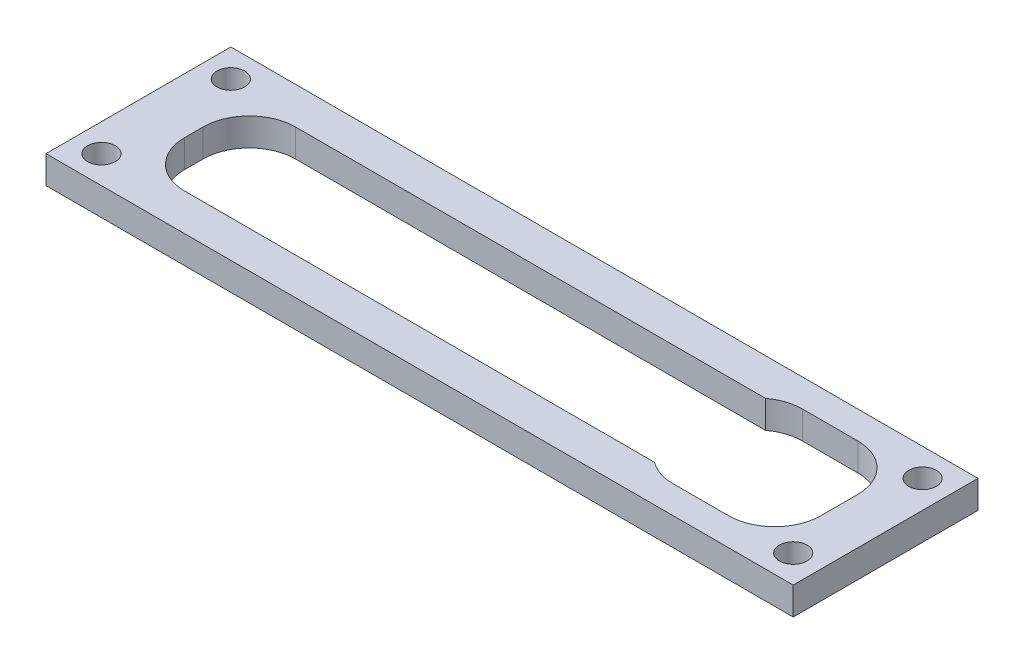
ISO-10303-21;
HEADER;
FILE_DESCRIPTION(('STEP AP214'),'2;1');
FILE_NAME('part.step','',(''),(''),'','','');
FILE_SCHEMA(('AUTOMOTIVE_DESIGN { 1 0 10303 214 1 1 1 1 }'));
ENDSEC;
DATA;
#1=APPLICATION_CONTEXT('core data for automotive mechanical design processes');
#2=APPLICATION_PROTOCOL_DEFINITION('international standard','automotive_design',2000,#1);
#3=PRODUCT_CONTEXT('',#1,'mechanical');
#4=PRODUCT('Part','Part','',(#3));
#5=PRODUCT_RELATED_PRODUCT_CATEGORY('part','',(#4));
#6=PRODUCT_DEFINITION_FORMATION('','',#4);
#7=PRODUCT_DEFINITION_CONTEXT('part definition',#1,'design');
#8=PRODUCT_DEFINITION('design','',#6,#7);
#9=PRODUCT_DEFINITION_SHAPE('','',#8);
#10=(LENGTH_UNIT() NAMED_UNIT(*) SI_UNIT(.MILLI.,.METRE.));
#11=(NAMED_UNIT(*) PLANE_ANGLE_UNIT() SI_UNIT($,.RADIAN.));
#12=(NAMED_UNIT(*) SI_UNIT($,.STERADIAN.) SOLID_ANGLE_UNIT());
#13=UNCERTAINTY_MEASURE_WITH_UNIT(LENGTH_MEASURE(1.E-05),#10,'distance_accuracy_value','');
#14=(GEOMETRIC_REPRESENTATION_CONTEXT(3) GLOBAL_UNCERTAINTY_ASSIGNED_CONTEXT((#13)) GLOBAL_UNIT_ASSIGNED_CONTEXT((#10,
#11,#12)) REPRESENTATION_CONTEXT('',''));
#15=CARTESIAN_POINT('',(0.,0.,0.));
#16=DIRECTION('',(0.,0.,1.));
#17=DIRECTION('',(1.,0.,0.));
#18=AXIS2_PLACEMENT_3D('',#15,#16,#17);
#19=CARTESIAN_POINT('',(0.,3.,0.));
#20=DIRECTION('',(0.,-1.,0.));
#21=DIRECTION('',(0.,0.,-1.));
#22=AXIS2_PLACEMENT_3D('',#19,#20,#21);
#23=PLANE('',#22);
#24=DIRECTION('',(0.,0.,1.));
#25=VECTOR('',#24,1.);
#26=CARTESIAN_POINT('',(0.,3.,0.));
#27=LINE('',#26,#25);
#28=CARTESIAN_POINT('',(0.,3.,-20.));
#29=VERTEX_POINT('',#28);
#30=CARTESIAN_POINT('',(0.,3.,0.));
#31=VERTEX_POINT('',#30);
#32=EDGE_CURVE('E250',#29,#31,#27,.T.);
#33=ORIENTED_EDGE('',*,*,#32,.T.);
#34=DIRECTION('',(1.,0.,0.));
#35=VECTOR('',#34,1.);
#36=CARTESIAN_POINT('',(0.,3.,0.));
#37=LINE('',#36,#35);
#38=CARTESIAN_POINT('',(80.8638902656017,3.,0.));
#39=VERTEX_POINT('',#38);
#40=EDGE_CURVE('E253',#31,#39,#37,.T.);
#41=ORIENTED_EDGE('',*,*,#40,.T.);
#42=DIRECTION('',(0.,0.,-1.));
#43=VECTOR('',#42,1.);
#44=CARTESIAN_POINT('',(80.8638902656017,3.,0.));
#45=LINE('',#44,#43);
#46=CARTESIAN_POINT('',(80.8638902656017,3.,-20.));
#47=VERTEX_POINT('',#46);
#48=EDGE_CURVE('E256',#39,#47,#45,.T.);
#49=ORIENTED_EDGE('',*,*,#48,.T.);
#50=DIRECTION('',(-1.,0.,0.));
#51=VECTOR('',#50,1.);
#52=CARTESIAN_POINT('',(0.,3.,-20.));
#53=LINE('',#52,#51);
#54=EDGE_CURVE('E258',#47,#29,#53,.T.);
#55=ORIENTED_EDGE('',*,*,#54,.T.);
#56=EDGE_LOOP('',(#33,#41,#49,#55));
#57=FACE_BOUND('',#56,.T.);
#58=DIRECTION('',(-1.,0.,0.));
#59=VECTOR('',#58,1.);
#60=CARTESIAN_POINT('',(5.99999999999999,3.,-16.));
#61=LINE('',#60,#59);
#62=CARTESIAN_POINT('',(61.8638902656017,3.,-16.));
#63=VERTEX_POINT('',#62);
#64=CARTESIAN_POINT('',(11.,3.,-16.));
#65=VERTEX_POINT('',#64);
#66=EDGE_CURVE('E243',#63,#65,#61,.T.);
#67=ORIENTED_EDGE('',*,*,#66,.F.);
#68=CARTESIAN_POINT('',(64.8638902656017,3.,-12.));
#69=DIRECTION('',(0.,-1.,0.));
#70=DIRECTION('',(0.,0.,-1.));
#71=AXIS2_PLACEMENT_3D('',#68,#69,#70);
#72=CIRCLE('',#71,5.);
#73=CARTESIAN_POINT('',(64.8638902656017,3.,-17.));
#74=VERTEX_POINT('',#73);
#75=EDGE_CURVE('E193',#63,#74,#72,.T.);
#76=ORIENTED_EDGE('',*,*,#75,.T.);
#77=DIRECTION('',(-1.,0.,0.));
#78=VECTOR('',#77,1.);
#79=CARTESIAN_POINT('',(61.8638902656017,3.,-17.));
#80=LINE('',#79,#78);
#81=CARTESIAN_POINT('',(70.8638902656017,3.,-17.));
#82=VERTEX_POINT('',#81);
#83=EDGE_CURVE('E205',#82,#74,#80,.T.);
#84=ORIENTED_EDGE('',*,*,#83,.F.);
#85=CARTESIAN_POINT('',(70.8638902656017,3.,-12.));
#86=DIRECTION('',(0.,-1.,0.));
#87=DIRECTION('',(0.,0.,-1.));
#88=AXIS2_PLACEMENT_3D('',#85,#86,#87);
#89=CIRCLE('',#88,5.);
#90=CARTESIAN_POINT('',(75.8638902656017,3.,-12.));
#91=VERTEX_POINT('',#90);
#92=EDGE_CURVE('E185',#82,#91,#89,.T.);
#93=ORIENTED_EDGE('',*,*,#92,.T.);
#94=DIRECTION('',(0.,0.,-1.));
#95=VECTOR('',#94,1.);
#96=CARTESIAN_POINT('',(75.8638902656017,3.,-17.));
#97=LINE('',#96,#95);
#98=CARTESIAN_POINT('',(75.8638902656017,3.,-8.00000000000001));
#99=VERTEX_POINT('',#98);
#100=EDGE_CURVE('E202',#99,#91,#97,.T.);
#101=ORIENTED_EDGE('',*,*,#100,.F.);
#102=CARTESIAN_POINT('',(70.8638902656017,3.,-8.00000000000001));
#103=DIRECTION('',(0.,-1.,0.));
#104=DIRECTION('',(0.,0.,-1.));
#105=AXIS2_PLACEMENT_3D('',#102,#103,#104);
#106=CIRCLE('',#105,5.);
#107=CARTESIAN_POINT('',(70.8638902656017,3.,-3.00000000000001));
#108=VERTEX_POINT('',#107);
#109=EDGE_CURVE('E189',#99,#108,#106,.T.);
#110=ORIENTED_EDGE('',*,*,#109,.T.);
#111=DIRECTION('',(1.,0.,0.));
#112=VECTOR('',#111,1.);
#113=CARTESIAN_POINT('',(61.8638902656017,3.,-3.00000000000001));
#114=LINE('',#113,#112);
#115=CARTESIAN_POINT('',(64.8638902656017,3.,-3.00000000000001));
#116=VERTEX_POINT('',#115);
#117=EDGE_CURVE('E200',#116,#108,#114,.T.);
#118=ORIENTED_EDGE('',*,*,#117,.F.);
#119=CARTESIAN_POINT('',(64.8638902656017,3.,-8.00000000000001));
#120=DIRECTION('',(0.,-1.,0.));
#121=DIRECTION('',(0.,0.,-1.));
#122=AXIS2_PLACEMENT_3D('',#119,#120,#121);
#123=CIRCLE('',#122,5.);
#124=CARTESIAN_POINT('',(61.8638902656017,3.,-4.00000000000001));
#125=VERTEX_POINT('',#124);
#126=EDGE_CURVE('E43',#116,#125,#123,.T.);
#127=ORIENTED_EDGE('',*,*,#126,.T.);
#128=DIRECTION('',(1.,0.,0.));
#129=VECTOR('',#128,1.);
#130=CARTESIAN_POINT('',(5.99999999999999,3.,-4.00000000000002));
#131=LINE('',#130,#129);
#132=CARTESIAN_POINT('',(11.,3.,-4.00000000000002));
#133=VERTEX_POINT('',#132);
#134=EDGE_CURVE('E162',#133,#125,#131,.T.);
#135=ORIENTED_EDGE('',*,*,#134,.F.);
#136=CARTESIAN_POINT('',(11.,3.,-9.00000000000001));
#137=DIRECTION('',(0.,-1.,0.));
#138=DIRECTION('',(0.,0.,-1.));
#139=AXIS2_PLACEMENT_3D('',#136,#137,#138);
#140=CIRCLE('',#139,5.);
#141=CARTESIAN_POINT('',(5.99999999999999,3.,-9.00000000000001));
#142=VERTEX_POINT('',#141);
#143=EDGE_CURVE('E179',#133,#142,#140,.T.);
#144=ORIENTED_EDGE('',*,*,#143,.T.);
#145=DIRECTION('',(0.,0.,1.));
#146=VECTOR('',#145,1.);
#147=CARTESIAN_POINT('',(5.99999999999999,3.,-16.));
#148=LINE('',#147,#146);
#149=CARTESIAN_POINT('',(5.99999999999999,3.,-11.));
#150=VERTEX_POINT('',#149);
#151=EDGE_CURVE('E239',#150,#142,#148,.T.);
#152=ORIENTED_EDGE('',*,*,#151,.F.);
#153=CARTESIAN_POINT('',(11.,3.,-11.));
#154=DIRECTION('',(0.,-1.,0.));
#155=DIRECTION('',(0.,0.,-1.));
#156=AXIS2_PLACEMENT_3D('',#153,#154,#155);
#157=CIRCLE('',#156,5.);
#158=EDGE_CURVE('E183',#150,#65,#157,.T.);
#159=ORIENTED_EDGE('',*,*,#158,.T.);
#160=EDGE_LOOP('',(#67,#76,#84,#93,#101,#110,#118,#127,#135,#144,#152,#159));
#161=FACE_BOUND('',#160,.T.);
#162=CARTESIAN_POINT('',(3.,3.,-17.));
#163=DIRECTION('',(0.,1.,0.));
#164=DIRECTION('',(0.,0.,1.));
#165=AXIS2_PLACEMENT_3D('',#162,#163,#164);
#166=CIRCLE('',#165,1.5);
#167=CARTESIAN_POINT('',(3.,3.,-15.5));
#168=VERTEX_POINT('',#167);
#169=EDGE_CURVE('E234',#168,#168,#166,.T.);
#170=ORIENTED_EDGE('',*,*,#169,.F.);
#171=EDGE_LOOP('',(#170));
#172=FACE_BOUND('',#171,.T.);
#173=CARTESIAN_POINT('',(3.,3.,-3.));
#174=DIRECTION('',(0.,1.,0.));
#175=DIRECTION('',(0.,0.,-1.));
#176=AXIS2_PLACEMENT_3D('',#173,#174,#175);
#177=CIRCLE('',#176,1.5);
#178=CARTESIAN_POINT('',(3.,3.,-4.5));
#179=VERTEX_POINT('',#178);
#180=EDGE_CURVE('E228',#179,#179,#177,.T.);
#181=ORIENTED_EDGE('',*,*,#180,.F.);
#182=EDGE_LOOP('',(#181));
#183=FACE_BOUND('',#182,.T.);
#184=CARTESIAN_POINT('',(77.8638902656017,3.,-3.00000000000001));
#185=DIRECTION('',(0.,1.,0.));
#186=DIRECTION('',(0.,0.,1.));
#187=AXIS2_PLACEMENT_3D('',#184,#185,#186);
#188=CIRCLE('',#187,1.5);
#189=CARTESIAN_POINT('',(77.8638902656017,3.,-1.50000000000001));
#190=VERTEX_POINT('',#189);
#191=EDGE_CURVE('E222',#190,#190,#188,.T.);
#192=ORIENTED_EDGE('',*,*,#191,.F.);
#193=EDGE_LOOP('',(#192));
#194=FACE_BOUND('',#193,.T.);
#195=CARTESIAN_POINT('',(77.8638902656017,3.,-17.));
#196=DIRECTION('',(0.,1.,0.));
#197=DIRECTION('',(0.,0.,-1.));
#198=AXIS2_PLACEMENT_3D('',#195,#196,#197);
#199=CIRCLE('',#198,1.5);
#200=CARTESIAN_POINT('',(77.8638902656017,3.,-18.5));
#201=VERTEX_POINT('',#200);
#202=EDGE_CURVE('E216',#201,#201,#199,.T.);
#203=ORIENTED_EDGE('',*,*,#202,.F.);
#204=EDGE_LOOP('',(#203));
#205=FACE_BOUND('',#204,.T.);
#206=ADVANCED_FACE('F35',(#57,#161,#172,#183,#194,#205),#23,.F.);
#207=CARTESIAN_POINT('',(0.,0.,0.));
#208=DIRECTION('',(0.,-1.,0.));
#209=DIRECTION('',(0.,0.,-1.));
#210=AXIS2_PLACEMENT_3D('',#207,#208,#209);
#211=PLANE('',#210);
#212=DIRECTION('',(-1.,0.,0.));
#213=VECTOR('',#212,1.);
#214=CARTESIAN_POINT('',(61.8638902656017,0.,-17.));
#215=LINE('',#214,#213);
#216=CARTESIAN_POINT('',(70.8638902656017,0.,-17.));
#217=VERTEX_POINT('',#216);
#218=CARTESIAN_POINT('',(64.8638902656017,0.,-17.));
#219=VERTEX_POINT('',#218);
#220=EDGE_CURVE('E165',#217,#219,#215,.T.);
#221=ORIENTED_EDGE('',*,*,#220,.T.);
#222=CARTESIAN_POINT('',(64.8638902656017,0.,-12.));
#223=DIRECTION('',(0.,-1.,0.));
#224=DIRECTION('',(0.,0.,-1.));
#225=AXIS2_PLACEMENT_3D('',#222,#223,#224);
#226=CIRCLE('',#225,5.);
#227=CARTESIAN_POINT('',(61.8638902656017,0.,-16.));
#228=VERTEX_POINT('',#227);
#229=EDGE_CURVE('E195',#219,#228,#226,.F.);
#230=ORIENTED_EDGE('',*,*,#229,.T.);
#231=DIRECTION('',(-1.,0.,0.));
#232=VECTOR('',#231,1.);
#233=CARTESIAN_POINT('',(5.99999999999999,0.,-16.));
#234=LINE('',#233,#232);
#235=CARTESIAN_POINT('',(11.,0.,-16.));
#236=VERTEX_POINT('',#235);
#237=EDGE_CURVE('E154',#228,#236,#234,.T.);
#238=ORIENTED_EDGE('',*,*,#237,.T.);
#239=CARTESIAN_POINT('',(11.,0.,-11.));
#240=DIRECTION('',(0.,-1.,0.));
#241=DIRECTION('',(0.,0.,-1.));
#242=AXIS2_PLACEMENT_3D('',#239,#240,#241);
#243=CIRCLE('',#242,5.);
#244=CARTESIAN_POINT('',(5.99999999999999,0.,-11.));
#245=VERTEX_POINT('',#244);
#246=EDGE_CURVE('E181',#236,#245,#243,.F.);
#247=ORIENTED_EDGE('',*,*,#246,.T.);
#248=DIRECTION('',(0.,0.,1.));
#249=VECTOR('',#248,1.);
#250=CARTESIAN_POINT('',(5.99999999999999,0.,-16.));
#251=LINE('',#250,#249);
#252=CARTESIAN_POINT('',(5.99999999999999,0.,-9.00000000000001));
#253=VERTEX_POINT('',#252);
#254=EDGE_CURVE('E155',#245,#253,#251,.T.);
#255=ORIENTED_EDGE('',*,*,#254,.T.);
#256=CARTESIAN_POINT('',(11.,0.,-9.00000000000001));
#257=DIRECTION('',(0.,-1.,0.));
#258=DIRECTION('',(0.,0.,-1.));
#259=AXIS2_PLACEMENT_3D('',#256,#257,#258);
#260=CIRCLE('',#259,5.);
#261=CARTESIAN_POINT('',(11.,0.,-4.00000000000002));
#262=VERTEX_POINT('',#261);
#263=EDGE_CURVE('E151',#253,#262,#260,.F.);
#264=ORIENTED_EDGE('',*,*,#263,.T.);
#265=DIRECTION('',(1.,0.,0.));
#266=VECTOR('',#265,1.);
#267=CARTESIAN_POINT('',(5.99999999999999,0.,-4.00000000000002));
#268=LINE('',#267,#266);
#269=CARTESIAN_POINT('',(61.8638902656017,0.,-4.00000000000001));
#270=VERTEX_POINT('',#269);
#271=EDGE_CURVE('E145',#262,#270,#268,.T.);
#272=ORIENTED_EDGE('',*,*,#271,.T.);
#273=CARTESIAN_POINT('',(64.8638902656017,0.,-8.00000000000001));
#274=DIRECTION('',(0.,-1.,0.));
#275=DIRECTION('',(0.,0.,-1.));
#276=AXIS2_PLACEMENT_3D('',#273,#274,#275);
#277=CIRCLE('',#276,5.);
#278=CARTESIAN_POINT('',(64.8638902656017,0.,-3.00000000000001));
#279=VERTEX_POINT('',#278);
#280=EDGE_CURVE('E11',#270,#279,#277,.F.);
#281=ORIENTED_EDGE('',*,*,#280,.T.);
#282=DIRECTION('',(1.,0.,0.));
#283=VECTOR('',#282,1.);
#284=CARTESIAN_POINT('',(61.8638902656017,0.,-3.00000000000001));
#285=LINE('',#284,#283);
#286=CARTESIAN_POINT('',(70.8638902656017,0.,-3.00000000000001));
#287=VERTEX_POINT('',#286);
#288=EDGE_CURVE('E212',#279,#287,#285,.T.);
#289=ORIENTED_EDGE('',*,*,#288,.T.);
#290=CARTESIAN_POINT('',(70.8638902656017,0.,-8.00000000000001));
#291=DIRECTION('',(0.,-1.,0.));
#292=DIRECTION('',(0.,0.,-1.));
#293=AXIS2_PLACEMENT_3D('',#290,#291,#292);
#294=CIRCLE('',#293,5.);
#295=CARTESIAN_POINT('',(75.8638902656017,0.,-8.00000000000001));
#296=VERTEX_POINT('',#295);
#297=EDGE_CURVE('E191',#287,#296,#294,.F.);
#298=ORIENTED_EDGE('',*,*,#297,.T.);
#299=DIRECTION('',(0.,0.,-1.));
#300=VECTOR('',#299,1.);
#301=CARTESIAN_POINT('',(75.8638902656017,0.,-17.));
#302=LINE('',#301,#300);
#303=CARTESIAN_POINT('',(75.8638902656017,0.,-12.));
#304=VERTEX_POINT('',#303);
#305=EDGE_CURVE('E300',#296,#304,#302,.T.);
#306=ORIENTED_EDGE('',*,*,#305,.T.);
#307=CARTESIAN_POINT('',(70.8638902656017,0.,-12.));
#308=DIRECTION('',(0.,-1.,0.));
#309=DIRECTION('',(0.,0.,-1.));
#310=AXIS2_PLACEMENT_3D('',#307,#308,#309);
#311=CIRCLE('',#310,5.);
#312=EDGE_CURVE('E187',#304,#217,#311,.F.);
#313=ORIENTED_EDGE('',*,*,#312,.T.);
#314=EDGE_LOOP('',(#221,#230,#238,#247,#255,#264,#272,#281,#289,#298,#306,#313));
#315=FACE_BOUND('',#314,.T.);
#316=CARTESIAN_POINT('',(77.8638902656017,0.,-3.00000000000001));
#317=DIRECTION('',(0.,1.,0.));
#318=DIRECTION('',(0.,0.,1.));
#319=AXIS2_PLACEMENT_3D('',#316,#317,#318);
#320=CIRCLE('',#319,1.5);
#321=CARTESIAN_POINT('',(77.8638902656017,0.,-1.50000000000001));
#322=VERTEX_POINT('',#321);
#323=EDGE_CURVE('E219',#322,#322,#320,.T.);
#324=ORIENTED_EDGE('',*,*,#323,.T.);
#325=EDGE_LOOP('',(#324));
#326=FACE_BOUND('',#325,.T.);
#327=CARTESIAN_POINT('',(3.,0.,-17.));
#328=DIRECTION('',(0.,1.,0.));
#329=DIRECTION('',(0.,0.,1.));
#330=AXIS2_PLACEMENT_3D('',#327,#328,#329);
#331=CIRCLE('',#330,1.5);
#332=CARTESIAN_POINT('',(3.,0.,-15.5));
#333=VERTEX_POINT('',#332);
#334=EDGE_CURVE('E231',#333,#333,#331,.T.);
#335=ORIENTED_EDGE('',*,*,#334,.T.);
#336=EDGE_LOOP('',(#335));
#337=FACE_BOUND('',#336,.T.);
#338=DIRECTION('',(0.,0.,1.));
#339=VECTOR('',#338,1.);
#340=CARTESIAN_POINT('',(0.,0.,0.));
#341=LINE('',#340,#339);
#342=CARTESIAN_POINT('',(0.,0.,-20.));
#343=VERTEX_POINT('',#342);
#344=CARTESIAN_POINT('',(0.,0.,0.));
#345=VERTEX_POINT('',#344);
#346=EDGE_CURVE('E246',#343,#345,#341,.T.);
#347=ORIENTED_EDGE('',*,*,#346,.F.);
#348=DIRECTION('',(-1.,0.,0.));
#349=VECTOR('',#348,1.);
#350=CARTESIAN_POINT('',(0.,0.,-20.));
#351=LINE('',#350,#349);
#352=CARTESIAN_POINT('',(80.8638902656017,0.,-20.));
#353=VERTEX_POINT('',#352);
#354=EDGE_CURVE('E254',#353,#343,#351,.T.);
#355=ORIENTED_EDGE('',*,*,#354,.F.);
#356=DIRECTION('',(0.,0.,-1.));
#357=VECTOR('',#356,1.);
#358=CARTESIAN_POINT('',(80.8638902656017,0.,0.));
#359=LINE('',#358,#357);
#360=CARTESIAN_POINT('',(80.8638902656017,0.,0.));
#361=VERTEX_POINT('',#360);
#362=EDGE_CURVE('E265',#361,#353,#359,.T.);
#363=ORIENTED_EDGE('',*,*,#362,.F.);
#364=DIRECTION('',(1.,0.,0.));
#365=VECTOR('',#364,1.);
#366=CARTESIAN_POINT('',(0.,0.,0.));
#367=LINE('',#366,#365);
#368=EDGE_CURVE('E263',#345,#361,#367,.T.);
#369=ORIENTED_EDGE('',*,*,#368,.F.);
#370=EDGE_LOOP('',(#347,#355,#363,#369));
#371=FACE_BOUND('',#370,.T.);
#372=CARTESIAN_POINT('',(3.,0.,-3.));
#373=DIRECTION('',(0.,1.,0.));
#374=DIRECTION('',(0.,0.,-1.));
#375=AXIS2_PLACEMENT_3D('',#372,#373,#374);
#376=CIRCLE('',#375,1.5);
#377=CARTESIAN_POINT('',(3.,0.,-4.5));
#378=VERTEX_POINT('',#377);
#379=EDGE_CURVE('E225',#378,#378,#376,.T.);
#380=ORIENTED_EDGE('',*,*,#379,.T.);
#381=EDGE_LOOP('',(#380));
#382=FACE_BOUND('',#381,.T.);
#383=CARTESIAN_POINT('',(77.8638902656017,0.,-17.));
#384=DIRECTION('',(0.,1.,0.));
#385=DIRECTION('',(0.,0.,-1.));
#386=AXIS2_PLACEMENT_3D('',#383,#384,#385);
#387=CIRCLE('',#386,1.5);
#388=CARTESIAN_POINT('',(77.8638902656017,0.,-18.5));
#389=VERTEX_POINT('',#388);
#390=EDGE_CURVE('E214',#389,#389,#387,.T.);
#391=ORIENTED_EDGE('',*,*,#390,.T.);
#392=EDGE_LOOP('',(#391));
#393=FACE_BOUND('',#392,.T.);
#394=ADVANCED_FACE('F148',(#315,#326,#337,#371,#382,#393),#211,.T.);
#395=CARTESIAN_POINT('',(0.,3.,0.));
#396=DIRECTION('',(1.,0.,0.));
#397=DIRECTION('',(0.,0.,-1.));
#398=AXIS2_PLACEMENT_3D('',#395,#396,#397);
#399=PLANE('',#398);
#400=ORIENTED_EDGE('',*,*,#346,.T.);
#401=DIRECTION('',(0.,-1.,0.));
#402=VECTOR('',#401,1.);
#403=CARTESIAN_POINT('',(0.,3.,0.));
#404=LINE('',#403,#402);
#405=EDGE_CURVE('E276',#31,#345,#404,.T.);
#406=ORIENTED_EDGE('',*,*,#405,.F.);
#407=ORIENTED_EDGE('',*,*,#32,.F.);
#408=DIRECTION('',(0.,-1.,0.));
#409=VECTOR('',#408,1.);
#410=CARTESIAN_POINT('',(0.,3.,-20.));
#411=LINE('',#410,#409);
#412=EDGE_CURVE('E260',#29,#343,#411,.T.);
#413=ORIENTED_EDGE('',*,*,#412,.T.);
#414=EDGE_LOOP('',(#400,#406,#407,#413));
#415=FACE_BOUND('',#414,.T.);
#416=ADVANCED_FACE('F331',(#415),#399,.F.);
#417=CARTESIAN_POINT('',(0.,3.,0.));
#418=DIRECTION('',(0.,0.,-1.));
#419=DIRECTION('',(-1.,0.,0.));
#420=AXIS2_PLACEMENT_3D('',#417,#418,#419);
#421=PLANE('',#420);
#422=ORIENTED_EDGE('',*,*,#368,.T.);
#423=DIRECTION('',(0.,-1.,0.));
#424=VECTOR('',#423,1.);
#425=CARTESIAN_POINT('',(80.8638902656017,3.,0.));
#426=LINE('',#425,#424);
#427=EDGE_CURVE('E273',#39,#361,#426,.T.);
#428=ORIENTED_EDGE('',*,*,#427,.F.);
#429=ORIENTED_EDGE('',*,*,#40,.F.);
#430=ORIENTED_EDGE('',*,*,#405,.T.);
#431=EDGE_LOOP('',(#422,#428,#429,#430));
#432=FACE_BOUND('',#431,.T.);
#433=ADVANCED_FACE('F344',(#432),#421,.F.);
#434=CARTESIAN_POINT('',(80.8638902656017,3.,0.));
#435=DIRECTION('',(-1.,0.,0.));
#436=DIRECTION('',(0.,0.,1.));
#437=AXIS2_PLACEMENT_3D('',#434,#435,#436);
#438=PLANE('',#437);
#439=ORIENTED_EDGE('',*,*,#362,.T.);
#440=DIRECTION('',(0.,-1.,0.));
#441=VECTOR('',#440,1.);
#442=CARTESIAN_POINT('',(80.8638902656017,3.,-20.));
#443=LINE('',#442,#441);
#444=EDGE_CURVE('E270',#47,#353,#443,.T.);
#445=ORIENTED_EDGE('',*,*,#444,.F.);
#446=ORIENTED_EDGE('',*,*,#48,.F.);
#447=ORIENTED_EDGE('',*,*,#427,.T.);
#448=EDGE_LOOP('',(#439,#445,#446,#447));
#449=FACE_BOUND('',#448,.T.);
#450=ADVANCED_FACE('F340',(#449),#438,.F.);
#451=CARTESIAN_POINT('',(0.,3.,-20.));
#452=DIRECTION('',(0.,0.,1.));
#453=DIRECTION('',(1.,0.,0.));
#454=AXIS2_PLACEMENT_3D('',#451,#452,#453);
#455=PLANE('',#454);
#456=ORIENTED_EDGE('',*,*,#354,.T.);
#457=ORIENTED_EDGE('',*,*,#412,.F.);
#458=ORIENTED_EDGE('',*,*,#54,.F.);
#459=ORIENTED_EDGE('',*,*,#444,.T.);
#460=EDGE_LOOP('',(#456,#457,#458,#459));
#461=FACE_BOUND('',#460,.T.);
#462=ADVANCED_FACE('F337',(#461),#455,.F.);
#463=CARTESIAN_POINT('',(5.99999999999999,3.,-16.));
#464=DIRECTION('',(1.,0.,0.));
#465=DIRECTION('',(0.,0.,-1.));
#466=AXIS2_PLACEMENT_3D('',#463,#464,#465);
#467=PLANE('',#466);
#468=ORIENTED_EDGE('',*,*,#151,.T.);
#469=DIRECTION('',(0.,-1.,0.));
#470=VECTOR('',#469,1.);
#471=CARTESIAN_POINT('',(5.99999999999999,0.,-9.00000000000001));
#472=LINE('',#471,#470);
#473=EDGE_CURVE('E281',#142,#253,#472,.T.);
#474=ORIENTED_EDGE('',*,*,#473,.T.);
#475=ORIENTED_EDGE('',*,*,#254,.F.);
#476=DIRECTION('',(0.,-1.,0.));
#477=VECTOR('',#476,1.);
#478=CARTESIAN_POINT('',(5.99999999999999,3.,-11.));
#479=LINE('',#478,#477);
#480=EDGE_CURVE('E279',#245,#150,#479,.F.);
#481=ORIENTED_EDGE('',*,*,#480,.T.);
#482=EDGE_LOOP('',(#468,#474,#475,#481));
#483=FACE_BOUND('',#482,.T.);
#484=ADVANCED_FACE('F334',(#483),#467,.T.);
#485=CARTESIAN_POINT('',(5.99999999999999,3.,-4.00000000000002));
#486=DIRECTION('',(0.,0.,-1.));
#487=DIRECTION('',(-1.,0.,0.));
#488=AXIS2_PLACEMENT_3D('',#485,#486,#487);
#489=PLANE('',#488);
#490=ORIENTED_EDGE('',*,*,#271,.F.);
#491=DIRECTION('',(0.,-1.,0.));
#492=VECTOR('',#491,1.);
#493=CARTESIAN_POINT('',(11.,3.,-4.00000000000002));
#494=LINE('',#493,#492);
#495=EDGE_CURVE('E284',#262,#133,#494,.F.);
#496=ORIENTED_EDGE('',*,*,#495,.T.);
#497=ORIENTED_EDGE('',*,*,#134,.T.);
#498=DIRECTION('',(0.,1.,0.));
#499=VECTOR('',#498,1.);
#500=CARTESIAN_POINT('',(61.8638902656017,0.,-4.00000000000001));
#501=LINE('',#500,#499);
#502=EDGE_CURVE('E159',#270,#125,#501,.T.);
#503=ORIENTED_EDGE('',*,*,#502,.F.);
#504=EDGE_LOOP('',(#490,#496,#497,#503));
#505=FACE_BOUND('',#504,.T.);
#506=ADVANCED_FACE('F160',(#505),#489,.T.);
#507=CARTESIAN_POINT('',(5.99999999999999,3.,-16.));
#508=DIRECTION('',(0.,0.,1.));
#509=DIRECTION('',(1.,0.,0.));
#510=AXIS2_PLACEMENT_3D('',#507,#508,#509);
#511=PLANE('',#510);
#512=ORIENTED_EDGE('',*,*,#66,.T.);
#513=DIRECTION('',(0.,-1.,0.));
#514=VECTOR('',#513,1.);
#515=CARTESIAN_POINT('',(11.,0.,-16.));
#516=LINE('',#515,#514);
#517=EDGE_CURVE('E286',#65,#236,#516,.T.);
#518=ORIENTED_EDGE('',*,*,#517,.T.);
#519=ORIENTED_EDGE('',*,*,#237,.F.);
#520=DIRECTION('',(0.,1.,0.));
#521=VECTOR('',#520,1.);
#522=CARTESIAN_POINT('',(61.8638902656017,0.,-16.));
#523=LINE('',#522,#521);
#524=EDGE_CURVE('E164',#228,#63,#523,.T.);
#525=ORIENTED_EDGE('',*,*,#524,.T.);
#526=EDGE_LOOP('',(#512,#518,#519,#525));
#527=FACE_BOUND('',#526,.T.);
#528=ADVANCED_FACE('F366',(#527),#511,.T.);
#529=CARTESIAN_POINT('',(3.,3.,-17.));
#530=DIRECTION('',(0.,-1.,0.));
#531=DIRECTION('',(0.,0.,-1.));
#532=AXIS2_PLACEMENT_3D('',#529,#530,#531);
#533=CYLINDRICAL_SURFACE('',#532,1.5);
#534=ORIENTED_EDGE('',*,*,#169,.T.);
#535=EDGE_LOOP('',(#534));
#536=FACE_BOUND('',#535,.T.);
#537=ORIENTED_EDGE('',*,*,#334,.F.);
#538=EDGE_LOOP('',(#537));
#539=FACE_BOUND('',#538,.T.);
#540=ADVANCED_FACE('F379',(#536,#539),#533,.F.);
#541=CARTESIAN_POINT('',(3.,3.,-3.));
#542=DIRECTION('',(0.,-1.,0.));
#543=DIRECTION('',(0.,0.,-1.));
#544=AXIS2_PLACEMENT_3D('',#541,#542,#543);
#545=CYLINDRICAL_SURFACE('',#544,1.5);
#546=ORIENTED_EDGE('',*,*,#180,.T.);
#547=EDGE_LOOP('',(#546));
#548=FACE_BOUND('',#547,.T.);
#549=ORIENTED_EDGE('',*,*,#379,.F.);
#550=EDGE_LOOP('',(#549));
#551=FACE_BOUND('',#550,.T.);
#552=ADVANCED_FACE('F384',(#548,#551),#545,.F.);
#553=CARTESIAN_POINT('',(77.8638902656017,3.,-3.00000000000001));
#554=DIRECTION('',(0.,-1.,0.));
#555=DIRECTION('',(0.,0.,-1.));
#556=AXIS2_PLACEMENT_3D('',#553,#554,#555);
#557=CYLINDRICAL_SURFACE('',#556,1.5);
#558=ORIENTED_EDGE('',*,*,#191,.T.);
#559=EDGE_LOOP('',(#558));
#560=FACE_BOUND('',#559,.T.);
#561=ORIENTED_EDGE('',*,*,#323,.F.);
#562=EDGE_LOOP('',(#561));
#563=FACE_BOUND('',#562,.T.);
#564=ADVANCED_FACE('F388',(#560,#563),#557,.F.);
#565=CARTESIAN_POINT('',(77.8638902656017,3.,-17.));
#566=DIRECTION('',(0.,-1.,0.));
#567=DIRECTION('',(0.,0.,-1.));
#568=AXIS2_PLACEMENT_3D('',#565,#566,#567);
#569=CYLINDRICAL_SURFACE('',#568,1.5);
#570=ORIENTED_EDGE('',*,*,#202,.T.);
#571=EDGE_LOOP('',(#570));
#572=FACE_BOUND('',#571,.T.);
#573=ORIENTED_EDGE('',*,*,#390,.F.);
#574=EDGE_LOOP('',(#573));
#575=FACE_BOUND('',#574,.T.);
#576=ADVANCED_FACE('F392',(#572,#575),#569,.F.);
#577=CARTESIAN_POINT('',(61.8638902656017,0.,-17.));
#578=DIRECTION('',(0.,0.,-1.));
#579=DIRECTION('',(-1.,0.,0.));
#580=AXIS2_PLACEMENT_3D('',#577,#578,#579);
#581=PLANE('',#580);
#582=ORIENTED_EDGE('',*,*,#220,.F.);
#583=DIRECTION('',(0.,1.,0.));
#584=VECTOR('',#583,1.);
#585=CARTESIAN_POINT('',(70.8638902656017,3.,-17.));
#586=LINE('',#585,#584);
#587=EDGE_CURVE('E291',#217,#82,#586,.T.);
#588=ORIENTED_EDGE('',*,*,#587,.T.);
#589=ORIENTED_EDGE('',*,*,#83,.T.);
#590=DIRECTION('',(0.,1.,0.));
#591=VECTOR('',#590,1.);
#592=CARTESIAN_POINT('',(64.8638902656017,0.,-17.));
#593=LINE('',#592,#591);
#594=EDGE_CURVE('E289',#74,#219,#593,.F.);
#595=ORIENTED_EDGE('',*,*,#594,.T.);
#596=EDGE_LOOP('',(#582,#588,#589,#595));
#597=FACE_BOUND('',#596,.T.);
#598=ADVANCED_FACE('F310',(#597),#581,.F.);
#599=CARTESIAN_POINT('',(75.8638902656017,0.,-17.));
#600=DIRECTION('',(1.,0.,0.));
#601=DIRECTION('',(0.,0.,-1.));
#602=AXIS2_PLACEMENT_3D('',#599,#600,#601);
#603=PLANE('',#602);
#604=ORIENTED_EDGE('',*,*,#100,.T.);
#605=DIRECTION('',(0.,1.,0.));
#606=VECTOR('',#605,1.);
#607=CARTESIAN_POINT('',(75.8638902656017,0.,-12.));
#608=LINE('',#607,#606);
#609=EDGE_CURVE('E171',#91,#304,#608,.F.);
#610=ORIENTED_EDGE('',*,*,#609,.T.);
#611=ORIENTED_EDGE('',*,*,#305,.F.);
#612=DIRECTION('',(0.,1.,0.));
#613=VECTOR('',#612,1.);
#614=CARTESIAN_POINT('',(75.8638902656017,3.,-8.00000000000001));
#615=LINE('',#614,#613);
#616=EDGE_CURVE('E174',#296,#99,#615,.T.);
#617=ORIENTED_EDGE('',*,*,#616,.T.);
#618=EDGE_LOOP('',(#604,#610,#611,#617));
#619=FACE_BOUND('',#618,.T.);
#620=ADVANCED_FACE('F297',(#619),#603,.F.);
#621=CARTESIAN_POINT('',(61.8638902656017,0.,-3.00000000000001));
#622=DIRECTION('',(0.,0.,1.));
#623=DIRECTION('',(1.,0.,0.));
#624=AXIS2_PLACEMENT_3D('',#621,#622,#623);
#625=PLANE('',#624);
#626=ORIENTED_EDGE('',*,*,#117,.T.);
#627=DIRECTION('',(0.,1.,0.));
#628=VECTOR('',#627,1.);
#629=CARTESIAN_POINT('',(70.8638902656017,0.,-3.00000000000001));
#630=LINE('',#629,#628);
#631=EDGE_CURVE('E50',#108,#287,#630,.F.);
#632=ORIENTED_EDGE('',*,*,#631,.T.);
#633=ORIENTED_EDGE('',*,*,#288,.F.);
#634=DIRECTION('',(0.,-1.,0.));
#635=VECTOR('',#634,1.);
#636=CARTESIAN_POINT('',(64.8638902656017,0.,-3.00000000000001));
#637=LINE('',#636,#635);
#638=EDGE_CURVE('E169',#279,#116,#637,.F.);
#639=ORIENTED_EDGE('',*,*,#638,.T.);
#640=EDGE_LOOP('',(#626,#632,#633,#639));
#641=FACE_BOUND('',#640,.T.);
#642=ADVANCED_FACE('F355',(#641),#625,.F.);
#643=CARTESIAN_POINT('',(11.,3.,-9.00000000000001));
#644=DIRECTION('',(0.,1.,0.));
#645=DIRECTION('',(0.,0.,1.));
#646=AXIS2_PLACEMENT_3D('',#643,#644,#645);
#647=CYLINDRICAL_SURFACE('',#646,5.);
#648=ORIENTED_EDGE('',*,*,#143,.F.);
#649=ORIENTED_EDGE('',*,*,#495,.F.);
#650=ORIENTED_EDGE('',*,*,#263,.F.);
#651=ORIENTED_EDGE('',*,*,#473,.F.);
#652=EDGE_LOOP('',(#648,#649,#650,#651));
#653=FACE_BOUND('',#652,.T.);
#654=ADVANCED_FACE('F352',(#653),#647,.F.);
#655=CARTESIAN_POINT('',(11.,3.,-11.));
#656=DIRECTION('',(0.,1.,0.));
#657=DIRECTION('',(0.,0.,1.));
#658=AXIS2_PLACEMENT_3D('',#655,#656,#657);
#659=CYLINDRICAL_SURFACE('',#658,5.);
#660=ORIENTED_EDGE('',*,*,#158,.F.);
#661=ORIENTED_EDGE('',*,*,#480,.F.);
#662=ORIENTED_EDGE('',*,*,#246,.F.);
#663=ORIENTED_EDGE('',*,*,#517,.F.);
#664=EDGE_LOOP('',(#660,#661,#662,#663));
#665=FACE_BOUND('',#664,.T.);
#666=ADVANCED_FACE('F323',(#665),#659,.F.);
#667=CARTESIAN_POINT('',(70.8638902656017,0.,-12.));
#668=DIRECTION('',(0.,-1.,0.));
#669=DIRECTION('',(0.,0.,-1.));
#670=AXIS2_PLACEMENT_3D('',#667,#668,#669);
#671=CYLINDRICAL_SURFACE('',#670,5.);
#672=ORIENTED_EDGE('',*,*,#312,.F.);
#673=ORIENTED_EDGE('',*,*,#609,.F.);
#674=ORIENTED_EDGE('',*,*,#92,.F.);
#675=ORIENTED_EDGE('',*,*,#587,.F.);
#676=EDGE_LOOP('',(#672,#673,#674,#675));
#677=FACE_BOUND('',#676,.T.);
#678=ADVANCED_FACE('F307',(#677),#671,.F.);
#679=CARTESIAN_POINT('',(70.8638902656017,0.,-8.00000000000001));
#680=DIRECTION('',(0.,-1.,0.));
#681=DIRECTION('',(0.,0.,-1.));
#682=AXIS2_PLACEMENT_3D('',#679,#680,#681);
#683=CYLINDRICAL_SURFACE('',#682,5.);
#684=ORIENTED_EDGE('',*,*,#297,.F.);
#685=ORIENTED_EDGE('',*,*,#631,.F.);
#686=ORIENTED_EDGE('',*,*,#109,.F.);
#687=ORIENTED_EDGE('',*,*,#616,.F.);
#688=EDGE_LOOP('',(#684,#685,#686,#687));
#689=FACE_BOUND('',#688,.T.);
#690=ADVANCED_FACE('F314',(#689),#683,.F.);
#691=CARTESIAN_POINT('',(64.8638902656017,0.,-12.));
#692=DIRECTION('',(0.,1.,0.));
#693=DIRECTION('',(0.,0.,1.));
#694=AXIS2_PLACEMENT_3D('',#691,#692,#693);
#695=CYLINDRICAL_SURFACE('',#694,5.);
#696=ORIENTED_EDGE('',*,*,#229,.F.);
#697=ORIENTED_EDGE('',*,*,#594,.F.);
#698=ORIENTED_EDGE('',*,*,#75,.F.);
#699=ORIENTED_EDGE('',*,*,#524,.F.);
#700=EDGE_LOOP('',(#696,#697,#698,#699));
#701=FACE_BOUND('',#700,.T.);
#702=ADVANCED_FACE('F316',(#701),#695,.F.);
#703=CARTESIAN_POINT('',(64.8638902656017,0.,-8.00000000000001));
#704=DIRECTION('',(0.,-1.,0.));
#705=DIRECTION('',(0.,0.,-1.));
#706=AXIS2_PLACEMENT_3D('',#703,#704,#705);
#707=CYLINDRICAL_SURFACE('',#706,5.);
#708=ORIENTED_EDGE('',*,*,#280,.F.);
#709=ORIENTED_EDGE('',*,*,#502,.T.);
#710=ORIENTED_EDGE('',*,*,#126,.F.);
#711=ORIENTED_EDGE('',*,*,#638,.F.);
#712=EDGE_LOOP('',(#708,#709,#710,#711));
#713=FACE_BOUND('',#712,.T.);
#714=ADVANCED_FACE('F37',(#713),#707,.F.);
#715=CLOSED_SHELL('',(#206,#394,#416,#433,#450,#462,#484,#506,#528,#540,#552,#564,#576,#598,
#620,#642,#654,#666,#678,#690,#702,#714));
#716=MANIFOLD_SOLID_BREP('B2',#715);
#717=ADVANCED_BREP_SHAPE_REPRESENTATION('',(#18,#716),#14);
#718=SHAPE_DEFINITION_REPRESENTATION(#9,#717);
ENDSEC;
END-ISO-10303-21;
